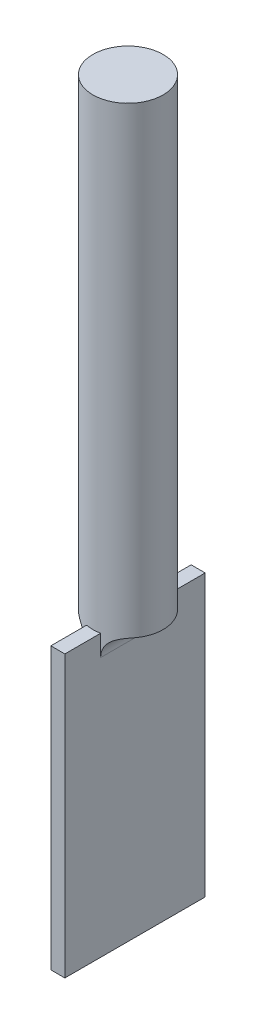
ISO-10303-21;
HEADER;
FILE_DESCRIPTION(('STEP AP214'),'2;1');
FILE_NAME('part.step','',(''),(''),'','','');
FILE_SCHEMA(('AUTOMOTIVE_DESIGN { 1 0 10303 214 1 1 1 1 }'));
ENDSEC;
DATA;
#1=APPLICATION_CONTEXT('core data for automotive mechanical design processes');
#2=APPLICATION_PROTOCOL_DEFINITION('international standard','automotive_design',2000,#1);
#3=PRODUCT_CONTEXT('',#1,'mechanical');
#4=PRODUCT('Part','Part','',(#3));
#5=PRODUCT_RELATED_PRODUCT_CATEGORY('part','',(#4));
#6=PRODUCT_DEFINITION_FORMATION('','',#4);
#7=PRODUCT_DEFINITION_CONTEXT('part definition',#1,'design');
#8=PRODUCT_DEFINITION('design','',#6,#7);
#9=PRODUCT_DEFINITION_SHAPE('','',#8);
#10=(LENGTH_UNIT() NAMED_UNIT(*) SI_UNIT(.MILLI.,.METRE.));
#11=(NAMED_UNIT(*) PLANE_ANGLE_UNIT() SI_UNIT($,.RADIAN.));
#12=(NAMED_UNIT(*) SI_UNIT($,.STERADIAN.) SOLID_ANGLE_UNIT());
#13=UNCERTAINTY_MEASURE_WITH_UNIT(LENGTH_MEASURE(1.E-05),#10,'distance_accuracy_value','');
#14=(GEOMETRIC_REPRESENTATION_CONTEXT(3) GLOBAL_UNCERTAINTY_ASSIGNED_CONTEXT((#13)) GLOBAL_UNIT_ASSIGNED_CONTEXT((#10,
#11,#12)) REPRESENTATION_CONTEXT('',''));
#15=CARTESIAN_POINT('',(0.,0.,0.));
#16=DIRECTION('',(0.,0.,1.));
#17=DIRECTION('',(1.,0.,0.));
#18=AXIS2_PLACEMENT_3D('',#15,#16,#17);
#19=CARTESIAN_POINT('',(0.,0.,0.));
#20=DIRECTION('',(0.,1.,0.));
#21=DIRECTION('',(0.,0.,1.));
#22=AXIS2_PLACEMENT_3D('',#19,#20,#21);
#23=PLANE('',#22);
#24=CARTESIAN_POINT('',(0.,0.,0.));
#25=DIRECTION('',(0.,1.,0.));
#26=DIRECTION('',(0.,0.,1.));
#27=AXIS2_PLACEMENT_3D('',#24,#25,#26);
#28=CIRCLE('',#27,6.35);
#29=CARTESIAN_POINT('',(5.08,0.,3.81));
#30=VERTEX_POINT('',#29);
#31=CARTESIAN_POINT('',(5.08,0.,-3.81));
#32=VERTEX_POINT('',#31);
#33=EDGE_CURVE('E175',#30,#32,#28,.T.);
#34=ORIENTED_EDGE('',*,*,#33,.F.);
#35=DIRECTION('',(0.,0.,1.));
#36=VECTOR('',#35,1.);
#37=CARTESIAN_POINT('',(5.08,0.,-6.22170394666927));
#38=LINE('',#37,#36);
#39=EDGE_CURVE('E185',#30,#32,#38,.F.);
#40=ORIENTED_EDGE('',*,*,#39,.T.);
#41=EDGE_LOOP('',(#34,#40));
#42=FACE_BOUND('',#41,.T.);
#43=ADVANCED_FACE('F39',(#42),#23,.F.);
#44=CARTESIAN_POINT('',(0.,83.82,0.));
#45=DIRECTION('',(0.,-1.,0.));
#46=DIRECTION('',(0.,0.,-1.));
#47=AXIS2_PLACEMENT_3D('',#44,#45,#46);
#48=CYLINDRICAL_SURFACE('',#47,6.35);
#49=CARTESIAN_POINT('',(0.,83.82,0.));
#50=DIRECTION('',(0.,1.,0.));
#51=DIRECTION('',(0.,0.,1.));
#52=AXIS2_PLACEMENT_3D('',#49,#50,#51);
#53=CIRCLE('',#52,6.35);
#54=CARTESIAN_POINT('',(0.,83.82,6.35));
#55=VERTEX_POINT('',#54);
#56=EDGE_CURVE('E166',#55,#55,#53,.T.);
#57=ORIENTED_EDGE('',*,*,#56,.F.);
#58=EDGE_LOOP('',(#57));
#59=FACE_BOUND('',#58,.T.);
#60=CARTESIAN_POINT('',(-1.27,0.,6.22170394666927));
#61=VERTEX_POINT('',#60);
#62=CARTESIAN_POINT('',(1.27,0.,6.22170394666927));
#63=VERTEX_POINT('',#62);
#64=EDGE_CURVE('E164',#61,#63,#28,.T.);
#65=ORIENTED_EDGE('',*,*,#64,.T.);
#66=DIRECTION('',(0.,-1.,0.));
#67=VECTOR('',#66,1.);
#68=CARTESIAN_POINT('',(1.27,-3.81,6.22170394666927));
#69=LINE('',#68,#67);
#70=CARTESIAN_POINT('',(1.27,-3.81,6.22170394666927));
#71=VERTEX_POINT('',#70);
#72=EDGE_CURVE('E177',#71,#63,#69,.F.);
#73=ORIENTED_EDGE('',*,*,#72,.F.);
#74=CARTESIAN_POINT('',(1.27,-3.81,6.22170394666927));
#75=CARTESIAN_POINT('',(1.26998793739721,-3.70623489363102,6.22168722016533));
#76=CARTESIAN_POINT('',(1.27423856433574,-3.60246989515915,6.22083812899461));
#77=CARTESIAN_POINT('',(1.29117947998453,-3.39565799828461,6.21735427499859));
#78=CARTESIAN_POINT('',(1.30387003834647,-3.29261112293191,6.21471945512006));
#79=CARTESIAN_POINT('',(1.33761589327543,-3.08789453820698,6.20754088873951));
#80=CARTESIAN_POINT('',(1.35867654240189,-2.98622575321079,6.20299592061648));
#81=CARTESIAN_POINT('',(1.40898646000373,-2.78505747179605,6.19176270983529));
#82=CARTESIAN_POINT('',(1.43823550073007,-2.6855579151263,6.18507452678701));
#83=CARTESIAN_POINT('',(1.50470440430106,-2.48935648428264,6.16924069958405));
#84=CARTESIAN_POINT('',(1.54193140664533,-2.39265720465215,6.16009285238957));
#85=CARTESIAN_POINT('',(1.62401841280142,-2.20283257505404,6.1389624666943));
#86=CARTESIAN_POINT('',(1.66888106548011,-2.10970847913205,6.12697894391045));
#87=CARTESIAN_POINT('',(1.76575155287849,-1.92785748912787,6.09976628046913));
#88=CARTESIAN_POINT('',(1.81775282880644,-1.83912665928657,6.08454011207531));
#89=CARTESIAN_POINT('',(1.92838753618004,-1.66665353831181,6.05038602574886));
#90=CARTESIAN_POINT('',(1.98702065442201,-1.58291101187941,6.0314582826007));
#91=CARTESIAN_POINT('',(2.10897668198812,-1.42273354326526,5.98988971756225));
#92=CARTESIAN_POINT('',(2.17217660634656,-1.34618279601193,5.96733436097372));
#93=CARTESIAN_POINT('',(2.30354760098341,-1.19903556189731,5.91786201203155));
#94=CARTESIAN_POINT('',(2.37171677424886,-1.12843682482023,5.89094667935447));
#95=CARTESIAN_POINT('',(2.51221213689452,-0.993611386983519,5.83241625074848));
#96=CARTESIAN_POINT('',(2.58453831179693,-0.929384664033891,5.80080117118701));
#97=CARTESIAN_POINT('',(2.7324275200643,-0.807638194553849,5.73262305338034));
#98=CARTESIAN_POINT('',(2.80799047189969,-0.750118279224692,5.69606013971362));
#99=CARTESIAN_POINT('',(2.95867747749816,-0.643884268646479,5.6192193514018));
#100=CARTESIAN_POINT('',(3.03372335073862,-0.594931473899038,5.57911755172669));
#101=CARTESIAN_POINT('',(3.18506035338194,-0.503472547293093,5.49412629289094));
#102=CARTESIAN_POINT('',(3.26135189301212,-0.460968588632297,5.44923522843406));
#103=CARTESIAN_POINT('',(3.41426706474028,-0.382344259635912,5.35475068103706));
#104=CARTESIAN_POINT('',(3.49089059260473,-0.346222016131616,5.30515858453845));
#105=CARTESIAN_POINT('',(3.64371003088014,-0.280112377361956,5.20138575443568));
#106=CARTESIAN_POINT('',(3.71990577320393,-0.250127249032978,5.14720333566321));
#107=CARTESIAN_POINT('',(3.8745661936935,-0.194743537139934,5.03189354835407));
#108=CARTESIAN_POINT('',(3.95297595868015,-0.169616353320168,4.97056218130154));
#109=CARTESIAN_POINT('',(4.10780162997255,-0.125244380112244,4.84340056000262));
#110=CARTESIAN_POINT('',(4.18421669862518,-0.106002026776457,4.77756845641562));
#111=CARTESIAN_POINT('',(4.40955571137198,-0.0563024193478578,4.57375173705416));
#112=CARTESIAN_POINT('',(4.55462750450787,-0.0338542669552364,4.42940667582586));
#113=CARTESIAN_POINT('',(4.76085662641197,-0.0127672896712092,4.20322332624395));
#114=CARTESIAN_POINT('',(4.82738641147119,-0.00782946019764055,4.12664057853695));
#115=CARTESIAN_POINT('',(4.95657665006043,-0.00145464874648546,3.9705235581936));
#116=CARTESIAN_POINT('',(5.01924817305936,-7.14838737102712E-06,3.89099888863545));
#117=CARTESIAN_POINT('',(5.08,0.,3.81));
#118=B_SPLINE_CURVE_WITH_KNOTS('',3,(#74,#75,#76,#77,#78,#79,#80,#81,#82,#83,#84,#85,#86,#87,
#88,#89,#90,#91,#92,#93,#94,#95,#96,#97,#98,#99,#100,#101,#102,#103,#104,#105,#106,#107,#108,
#109,#110,#111,#112,#113,#114,#115,#116,#117),.UNSPECIFIED.,.F.,.F.,(4,2,2,2,2,2,2,2,2,2,2,2,2,
2,2,2,2,2,2,2,2,4),(0.,0.311204945219113,0.622419833761724,0.933834061061613,1.24523962765599,
1.55692504440861,1.86871880848334,2.18022799784798,2.49172248162771,2.79673480959687,
3.10163130267924,3.4065267339481,3.71141448986936,4.00556993349037,4.29982428563136,
4.59399212386403,4.88826842690598,5.19595984737325,5.50377846623779,6.11920846278091,
6.42377345060547,6.72741945441038),.UNSPECIFIED.);
#119=EDGE_CURVE('E195',#71,#30,#118,.T.);
#120=ORIENTED_EDGE('',*,*,#119,.T.);
#121=ORIENTED_EDGE('',*,*,#33,.T.);
#122=CARTESIAN_POINT('',(5.08,0.,-3.81));
#123=CARTESIAN_POINT('',(5.00330797906707,-4.47873406911216E-06,-3.91228946664601));
#124=CARTESIAN_POINT('',(4.92346331248459,-0.00231679758030636,-4.01228163336102));
#125=CARTESIAN_POINT('',(4.75793482894148,-0.0127282182563427,-4.20723963387538));
#126=CARTESIAN_POINT('',(4.67224245716403,-0.0208359700203619,-4.30219772626395));
#127=CARTESIAN_POINT('',(4.49521454172408,-0.0440823902008019,-4.48687121482468));
#128=CARTESIAN_POINT('',(4.40384961621776,-0.0592608712863168,-4.57655364256303));
#129=CARTESIAN_POINT('',(4.21685881061943,-0.0978320894805859,-4.74939865433823));
#130=CARTESIAN_POINT('',(4.12123568824283,-0.121219575884682,-4.83256536451102));
#131=CARTESIAN_POINT('',(3.94476510968484,-0.172122651958333,-4.97713198851616));
#132=CARTESIAN_POINT('',(3.86444045406092,-0.198084303454596,-5.03971952095618));
#133=CARTESIAN_POINT('',(3.70248923781297,-0.25669508722016,-5.1598674824888));
#134=CARTESIAN_POINT('',(3.620862937612,-0.289342896877344,-5.21742890260692));
#135=CARTESIAN_POINT('',(3.45744507423277,-0.36161308187583,-5.32712209645205));
#136=CARTESIAN_POINT('',(3.37565474713196,-0.401214177883974,-5.37926968488347));
#137=CARTESIAN_POINT('',(3.21266166436294,-0.487702971321225,-5.47817416080688));
#138=CARTESIAN_POINT('',(3.13145889899345,-0.53459054815393,-5.52493113749499));
#139=CARTESIAN_POINT('',(2.97029800498385,-0.635985974727925,-5.61322682994161));
#140=CARTESIAN_POINT('',(2.89034815452815,-0.690530840287821,-5.65473821657145));
#141=CARTESIAN_POINT('',(2.73320718516041,-0.806963966239367,-5.73234329461289));
#142=CARTESIAN_POINT('',(2.65601612685089,-0.86885238781842,-5.76843686706676));
#143=CARTESIAN_POINT('',(2.50539056702062,-0.999759521622034,-5.83543666510538));
#144=CARTESIAN_POINT('',(2.43195952624069,-1.06878463217258,-5.86633816949768));
#145=CARTESIAN_POINT('',(2.28992097947075,-1.21349522099024,-5.92322689843369));
#146=CARTESIAN_POINT('',(2.22131326466018,-1.28918041059677,-5.9492143358089));
#147=CARTESIAN_POINT('',(2.09423994717148,-1.44135241309943,-5.99507393585589));
#148=CARTESIAN_POINT('',(2.03540239307904,-1.51744086476071,-6.01524033483812));
#149=CARTESIAN_POINT('',(1.92328221304443,-1.67445712788413,-6.05202183152592));
#150=CARTESIAN_POINT('',(1.87000155454147,-1.75538663749017,-6.06863567360751));
#151=CARTESIAN_POINT('',(1.76954722295613,-1.9215034405814,-6.09868468454762));
#152=CARTESIAN_POINT('',(1.72237285249152,-2.00669024630959,-6.11212021653743));
#153=CARTESIAN_POINT('',(1.63454318642517,-2.18075259771802,-6.13619047118929));
#154=CARTESIAN_POINT('',(1.59389016954312,-2.26962941918325,-6.14682421566886));
#155=CARTESIAN_POINT('',(1.48041852762844,-2.54540592568017,-6.17552666369294));
#156=CARTESIAN_POINT('',(1.41857310225978,-2.73736424107685,-6.18969877165444));
#157=CARTESIAN_POINT('',(1.32601912729589,-3.12874645807449,-6.21018886514179));
#158=CARTESIAN_POINT('',(1.29526124862716,-3.32815800990007,-6.21651929728878));
#159=CARTESIAN_POINT('',(1.27693781083457,-3.57539740664455,-6.22028317231951));
#160=CARTESIAN_POINT('',(1.27433477595701,-3.6223140025158,-6.22081719384414));
#161=CARTESIAN_POINT('',(1.27086798569016,-3.71614907084978,-6.22152755664664));
#162=CARTESIAN_POINT('',(1.27000182605007,-3.76306745069082,-6.22170439235758));
#163=CARTESIAN_POINT('',(1.27,-3.81,-6.22170394666927));
#164=B_SPLINE_CURVE_WITH_KNOTS('',3,(#122,#123,#124,#125,#126,#127,#128,#129,#130,#131,#132,
#133,#134,#135,#136,#137,#138,#139,#140,#141,#142,#143,#144,#145,#146,#147,#148,#149,#150,#151,
#152,#153,#154,#155,#156,#157,#158,#159,#160,#161,#162,#163),.UNSPECIFIED.,.F.,.F.,(4,2,2,2,2,2,
2,2,2,2,2,2,2,2,2,2,2,2,2,2,4),(0.,0.383542226160819,0.767658104208947,1.15396343528999,
1.54002212382674,1.85496842152536,2.16985247867761,2.48378916961725,2.79772066523627,
3.11322562210473,3.42873750543163,3.74453475173629,4.06031831751828,4.35480337773452,
4.64939235002186,4.94394764837806,5.23860564837817,5.8422506041638,6.44493619773998,
6.58589241636388,6.72665338280037),.UNSPECIFIED.);
#165=CARTESIAN_POINT('',(1.27,-3.81,-6.22170394666927));
#166=VERTEX_POINT('',#165);
#167=EDGE_CURVE('E200',#32,#166,#164,.T.);
#168=ORIENTED_EDGE('',*,*,#167,.T.);
#169=DIRECTION('',(0.,-1.,0.));
#170=VECTOR('',#169,1.);
#171=CARTESIAN_POINT('',(1.27,0.,-6.22170394666927));
#172=LINE('',#171,#170);
#173=CARTESIAN_POINT('',(1.27,0.,-6.22170394666927));
#174=VERTEX_POINT('',#173);
#175=EDGE_CURVE('E66',#174,#166,#172,.T.);
#176=ORIENTED_EDGE('',*,*,#175,.F.);
#177=CARTESIAN_POINT('',(-1.27,0.,-6.22170394666927));
#178=VERTEX_POINT('',#177);
#179=EDGE_CURVE('E179',#174,#178,#28,.T.);
#180=ORIENTED_EDGE('',*,*,#179,.T.);
#181=DIRECTION('',(0.,-1.,0.));
#182=VECTOR('',#181,1.);
#183=CARTESIAN_POINT('',(-1.27,-3.81,-6.22170394666927));
#184=LINE('',#183,#182);
#185=CARTESIAN_POINT('',(-1.27,-3.81,-6.22170394666927));
#186=VERTEX_POINT('',#185);
#187=EDGE_CURVE('E190',#186,#178,#184,.F.);
#188=ORIENTED_EDGE('',*,*,#187,.F.);
#189=CARTESIAN_POINT('',(-1.27,-3.81,-6.22170394666927));
#190=CARTESIAN_POINT('',(-1.26998793739721,-3.70623489363102,-6.22168722016533));
#191=CARTESIAN_POINT('',(-1.27423856433574,-3.60246989515915,-6.22083812899461));
#192=CARTESIAN_POINT('',(-1.29117947998453,-3.39565799828461,-6.21735427499859));
#193=CARTESIAN_POINT('',(-1.30387003834647,-3.29261112293191,-6.21471945512006));
#194=CARTESIAN_POINT('',(-1.33761589327543,-3.08789453820698,-6.20754088873951));
#195=CARTESIAN_POINT('',(-1.35867654240189,-2.98622575321079,-6.20299592061648));
#196=CARTESIAN_POINT('',(-1.40898646000373,-2.78505747179605,-6.19176270983529));
#197=CARTESIAN_POINT('',(-1.43823550073007,-2.6855579151263,-6.18507452678701));
#198=CARTESIAN_POINT('',(-1.50470440430106,-2.48935648428264,-6.16924069958405));
#199=CARTESIAN_POINT('',(-1.54193140664533,-2.39265720465215,-6.16009285238957));
#200=CARTESIAN_POINT('',(-1.62401841280142,-2.20283257505404,-6.1389624666943));
#201=CARTESIAN_POINT('',(-1.66888106548011,-2.10970847913205,-6.12697894391045));
#202=CARTESIAN_POINT('',(-1.76575155287849,-1.92785748912787,-6.09976628046913));
#203=CARTESIAN_POINT('',(-1.81775282880644,-1.83912665928657,-6.08454011207531));
#204=CARTESIAN_POINT('',(-1.92838753618004,-1.66665353831181,-6.05038602574886));
#205=CARTESIAN_POINT('',(-1.98702065442201,-1.58291101187941,-6.0314582826007));
#206=CARTESIAN_POINT('',(-2.10897668198812,-1.42273354326526,-5.98988971756225));
#207=CARTESIAN_POINT('',(-2.17217660634656,-1.34618279601193,-5.96733436097372));
#208=CARTESIAN_POINT('',(-2.30354760098341,-1.19903556189731,-5.91786201203155));
#209=CARTESIAN_POINT('',(-2.37171677424886,-1.12843682482023,-5.89094667935447));
#210=CARTESIAN_POINT('',(-2.51221213689452,-0.993611386983519,-5.83241625074848));
#211=CARTESIAN_POINT('',(-2.58453831179693,-0.929384664033891,-5.80080117118701));
#212=CARTESIAN_POINT('',(-2.7324275200643,-0.807638194553849,-5.73262305338034));
#213=CARTESIAN_POINT('',(-2.80799047189969,-0.750118279224692,-5.69606013971362));
#214=CARTESIAN_POINT('',(-2.95867747749816,-0.643884268646479,-5.6192193514018));
#215=CARTESIAN_POINT('',(-3.03372335073862,-0.594931473899038,-5.57911755172669));
#216=CARTESIAN_POINT('',(-3.18506035338194,-0.503472547293093,-5.49412629289094));
#217=CARTESIAN_POINT('',(-3.26135189301212,-0.460968588632297,-5.44923522843406));
#218=CARTESIAN_POINT('',(-3.41426706474028,-0.382344259635912,-5.35475068103706));
#219=CARTESIAN_POINT('',(-3.49089059260473,-0.346222016131616,-5.30515858453845));
#220=CARTESIAN_POINT('',(-3.64371003088014,-0.280112377361956,-5.20138575443568));
#221=CARTESIAN_POINT('',(-3.71990577320393,-0.250127249032978,-5.14720333566321));
#222=CARTESIAN_POINT('',(-3.8745661936935,-0.194743537139934,-5.03189354835407));
#223=CARTESIAN_POINT('',(-3.95297595868015,-0.169616353320168,-4.97056218130154));
#224=CARTESIAN_POINT('',(-4.10780162997255,-0.125244380112244,-4.84340056000262));
#225=CARTESIAN_POINT('',(-4.18421669862518,-0.106002026776457,-4.77756845641562));
#226=CARTESIAN_POINT('',(-4.40955571137198,-0.0563024193478578,-4.57375173705416));
#227=CARTESIAN_POINT('',(-4.55462750450787,-0.0338542669552364,-4.42940667582586));
#228=CARTESIAN_POINT('',(-4.76085662641197,-0.0127672896712092,-4.20322332624395));
#229=CARTESIAN_POINT('',(-4.82738641147119,-0.00782946019764055,-4.12664057853695));
#230=CARTESIAN_POINT('',(-4.95657665006043,-0.00145464874648546,-3.9705235581936));
#231=CARTESIAN_POINT('',(-5.01924817305936,-7.14838737102712E-06,-3.89099888863545));
#232=CARTESIAN_POINT('',(-5.08,0.,-3.81));
#233=B_SPLINE_CURVE_WITH_KNOTS('',3,(#189,#190,#191,#192,#193,#194,#195,#196,#197,#198,#199,
#200,#201,#202,#203,#204,#205,#206,#207,#208,#209,#210,#211,#212,#213,#214,#215,#216,#217,#218,
#219,#220,#221,#222,#223,#224,#225,#226,#227,#228,#229,#230,#231,#232),.UNSPECIFIED.,.F.,.F.,(4,
2,2,2,2,2,2,2,2,2,2,2,2,2,2,2,2,2,2,2,2,4),(0.,0.311204945219113,0.622419833761724,
0.933834061061613,1.24523962765599,1.55692504440861,1.86871880848334,2.18022799784798,
2.49172248162771,2.79673480959687,3.10163130267924,3.4065267339481,3.71141448986936,
4.00556993349037,4.29982428563136,4.59399212386403,4.88826842690598,5.19595984737325,
5.50377846623779,6.11920846278091,6.42377345060547,6.72741945441038),.UNSPECIFIED.);
#234=CARTESIAN_POINT('',(-5.08,0.,-3.81));
#235=VERTEX_POINT('',#234);
#236=EDGE_CURVE('E11',#186,#235,#233,.T.);
#237=ORIENTED_EDGE('',*,*,#236,.T.);
#238=CARTESIAN_POINT('',(-5.08,0.,3.81));
#239=VERTEX_POINT('',#238);
#240=EDGE_CURVE('E173',#235,#239,#28,.T.);
#241=ORIENTED_EDGE('',*,*,#240,.T.);
#242=CARTESIAN_POINT('',(-5.08,0.,3.81));
#243=CARTESIAN_POINT('',(-5.00330797906707,-4.47873406911216E-06,3.91228946664601));
#244=CARTESIAN_POINT('',(-4.92346331248459,-0.00231679758030636,4.01228163336102));
#245=CARTESIAN_POINT('',(-4.75793482894148,-0.0127282182563427,4.20723963387538));
#246=CARTESIAN_POINT('',(-4.67224245716403,-0.0208359700203619,4.30219772626395));
#247=CARTESIAN_POINT('',(-4.49521454172408,-0.0440823902008019,4.48687121482468));
#248=CARTESIAN_POINT('',(-4.40384961621776,-0.0592608712863168,4.57655364256303));
#249=CARTESIAN_POINT('',(-4.21685881061943,-0.0978320894805859,4.74939865433823));
#250=CARTESIAN_POINT('',(-4.12123568824283,-0.121219575884682,4.83256536451102));
#251=CARTESIAN_POINT('',(-3.94476510968484,-0.172122651958333,4.97713198851616));
#252=CARTESIAN_POINT('',(-3.86444045406092,-0.198084303454596,5.03971952095618));
#253=CARTESIAN_POINT('',(-3.70248923781297,-0.25669508722016,5.1598674824888));
#254=CARTESIAN_POINT('',(-3.620862937612,-0.289342896877344,5.21742890260692));
#255=CARTESIAN_POINT('',(-3.45744507423277,-0.36161308187583,5.32712209645205));
#256=CARTESIAN_POINT('',(-3.37565474713196,-0.401214177883974,5.37926968488347));
#257=CARTESIAN_POINT('',(-3.21266166436294,-0.487702971321225,5.47817416080688));
#258=CARTESIAN_POINT('',(-3.13145889899345,-0.53459054815393,5.52493113749499));
#259=CARTESIAN_POINT('',(-2.97029800498385,-0.635985974727925,5.61322682994161));
#260=CARTESIAN_POINT('',(-2.89034815452815,-0.690530840287821,5.65473821657145));
#261=CARTESIAN_POINT('',(-2.73320718516041,-0.806963966239367,5.73234329461289));
#262=CARTESIAN_POINT('',(-2.65601612685089,-0.86885238781842,5.76843686706676));
#263=CARTESIAN_POINT('',(-2.50539056702062,-0.999759521622034,5.83543666510538));
#264=CARTESIAN_POINT('',(-2.43195952624069,-1.06878463217258,5.86633816949768));
#265=CARTESIAN_POINT('',(-2.28992097947075,-1.21349522099024,5.92322689843369));
#266=CARTESIAN_POINT('',(-2.22131326466018,-1.28918041059677,5.9492143358089));
#267=CARTESIAN_POINT('',(-2.09423994717148,-1.44135241309943,5.99507393585589));
#268=CARTESIAN_POINT('',(-2.03540239307904,-1.51744086476071,6.01524033483812));
#269=CARTESIAN_POINT('',(-1.92328221304443,-1.67445712788413,6.05202183152592));
#270=CARTESIAN_POINT('',(-1.87000155454147,-1.75538663749017,6.06863567360751));
#271=CARTESIAN_POINT('',(-1.76954722295613,-1.9215034405814,6.09868468454762));
#272=CARTESIAN_POINT('',(-1.72237285249152,-2.00669024630959,6.11212021653743));
#273=CARTESIAN_POINT('',(-1.63454318642517,-2.18075259771802,6.13619047118929));
#274=CARTESIAN_POINT('',(-1.59389016954312,-2.26962941918325,6.14682421566886));
#275=CARTESIAN_POINT('',(-1.48041852762844,-2.54540592568017,6.17552666369294));
#276=CARTESIAN_POINT('',(-1.41857310225978,-2.73736424107685,6.18969877165444));
#277=CARTESIAN_POINT('',(-1.32601912729589,-3.12874645807449,6.21018886514179));
#278=CARTESIAN_POINT('',(-1.29526124862716,-3.32815800990007,6.21651929728878));
#279=CARTESIAN_POINT('',(-1.27693781083457,-3.57539740664455,6.22028317231951));
#280=CARTESIAN_POINT('',(-1.27433477595701,-3.6223140025158,6.22081719384414));
#281=CARTESIAN_POINT('',(-1.27086798569016,-3.71614907084978,6.22152755664664));
#282=CARTESIAN_POINT('',(-1.27000182605007,-3.76306745069082,6.22170439235758));
#283=CARTESIAN_POINT('',(-1.27,-3.81,6.22170394666927));
#284=B_SPLINE_CURVE_WITH_KNOTS('',3,(#242,#243,#244,#245,#246,#247,#248,#249,#250,#251,#252,
#253,#254,#255,#256,#257,#258,#259,#260,#261,#262,#263,#264,#265,#266,#267,#268,#269,#270,#271,
#272,#273,#274,#275,#276,#277,#278,#279,#280,#281,#282,#283),.UNSPECIFIED.,.F.,.F.,(4,2,2,2,2,2,
2,2,2,2,2,2,2,2,2,2,2,2,2,2,4),(0.,0.383542226160819,0.767658104208947,1.15396343528999,
1.54002212382674,1.85496842152536,2.16985247867761,2.48378916961725,2.79772066523627,
3.11322562210473,3.42873750543163,3.74453475173629,4.06031831751828,4.35480337773452,
4.64939235002186,4.94394764837806,5.23860564837817,5.8422506041638,6.44493619773998,
6.58589241636388,6.72665338280037),.UNSPECIFIED.);
#285=CARTESIAN_POINT('',(-1.27,-3.81,6.22170394666927));
#286=VERTEX_POINT('',#285);
#287=EDGE_CURVE('E52',#239,#286,#284,.T.);
#288=ORIENTED_EDGE('',*,*,#287,.T.);
#289=DIRECTION('',(0.,-1.,0.));
#290=VECTOR('',#289,1.);
#291=CARTESIAN_POINT('',(-1.27,0.,6.22170394666927));
#292=LINE('',#291,#290);
#293=EDGE_CURVE('E58',#61,#286,#292,.T.);
#294=ORIENTED_EDGE('',*,*,#293,.F.);
#295=EDGE_LOOP('',(#65,#73,#120,#121,#168,#176,#180,#188,#237,#241,#288,#294));
#296=FACE_BOUND('',#295,.T.);
#297=ADVANCED_FACE('F204',(#59,#296),#48,.T.);
#298=CARTESIAN_POINT('',(0.,83.82,0.));
#299=DIRECTION('',(0.,1.,0.));
#300=DIRECTION('',(0.,0.,1.));
#301=AXIS2_PLACEMENT_3D('',#298,#299,#300);
#302=PLANE('',#301);
#303=ORIENTED_EDGE('',*,*,#56,.T.);
#304=EDGE_LOOP('',(#303));
#305=FACE_BOUND('',#304,.T.);
#306=ADVANCED_FACE('F230',(#305),#302,.T.);
#307=ORIENTED_EDGE('',*,*,#240,.F.);
#308=DIRECTION('',(0.,0.,1.));
#309=VECTOR('',#308,1.);
#310=CARTESIAN_POINT('',(-5.08,0.,0.));
#311=LINE('',#310,#309);
#312=EDGE_CURVE('E184',#235,#239,#311,.T.);
#313=ORIENTED_EDGE('',*,*,#312,.T.);
#314=EDGE_LOOP('',(#307,#313));
#315=FACE_BOUND('',#314,.T.);
#316=ADVANCED_FACE('F225',(#315),#23,.F.);
#317=CARTESIAN_POINT('',(-1.27,0.,12.7));
#318=DIRECTION('',(0.,1.,0.));
#319=DIRECTION('',(0.,0.,1.));
#320=AXIS2_PLACEMENT_3D('',#317,#318,#319);
#321=PLANE('',#320);
#322=ORIENTED_EDGE('',*,*,#179,.F.);
#323=DIRECTION('',(0.,0.,1.));
#324=VECTOR('',#323,1.);
#325=CARTESIAN_POINT('',(1.27,0.,12.7));
#326=LINE('',#325,#324);
#327=CARTESIAN_POINT('',(1.27,0.,-12.7));
#328=VERTEX_POINT('',#327);
#329=EDGE_CURVE('E155',#328,#174,#326,.T.);
#330=ORIENTED_EDGE('',*,*,#329,.F.);
#331=DIRECTION('',(1.,0.,0.));
#332=VECTOR('',#331,1.);
#333=CARTESIAN_POINT('',(-1.27,0.,-12.7));
#334=LINE('',#333,#332);
#335=CARTESIAN_POINT('',(-1.27,0.,-12.7));
#336=VERTEX_POINT('',#335);
#337=EDGE_CURVE('E167',#336,#328,#334,.T.);
#338=ORIENTED_EDGE('',*,*,#337,.F.);
#339=DIRECTION('',(0.,0.,1.));
#340=VECTOR('',#339,1.);
#341=CARTESIAN_POINT('',(-1.27,0.,12.7));
#342=LINE('',#341,#340);
#343=EDGE_CURVE('E134',#336,#178,#342,.T.);
#344=ORIENTED_EDGE('',*,*,#343,.T.);
#345=EDGE_LOOP('',(#322,#330,#338,#344));
#346=FACE_BOUND('',#345,.T.);
#347=ADVANCED_FACE('F231',(#346),#321,.T.);
#348=ORIENTED_EDGE('',*,*,#64,.F.);
#349=CARTESIAN_POINT('',(-1.27,0.,12.7));
#350=VERTEX_POINT('',#349);
#351=EDGE_CURVE('E159',#61,#350,#342,.T.);
#352=ORIENTED_EDGE('',*,*,#351,.T.);
#353=DIRECTION('',(1.,0.,0.));
#354=VECTOR('',#353,1.);
#355=CARTESIAN_POINT('',(-1.27,0.,12.7));
#356=LINE('',#355,#354);
#357=CARTESIAN_POINT('',(1.27,0.,12.7));
#358=VERTEX_POINT('',#357);
#359=EDGE_CURVE('E162',#350,#358,#356,.T.);
#360=ORIENTED_EDGE('',*,*,#359,.T.);
#361=EDGE_CURVE('E150',#63,#358,#326,.T.);
#362=ORIENTED_EDGE('',*,*,#361,.F.);
#363=EDGE_LOOP('',(#348,#352,#360,#362));
#364=FACE_BOUND('',#363,.T.);
#365=ADVANCED_FACE('F236',(#364),#321,.T.);
#366=CARTESIAN_POINT('',(-1.27,-50.8,12.7));
#367=DIRECTION('',(0.,0.,1.));
#368=DIRECTION('',(1.,0.,0.));
#369=AXIS2_PLACEMENT_3D('',#366,#367,#368);
#370=PLANE('',#369);
#371=DIRECTION('',(1.,0.,0.));
#372=VECTOR('',#371,1.);
#373=CARTESIAN_POINT('',(-1.27,-50.8,12.7));
#374=LINE('',#373,#372);
#375=CARTESIAN_POINT('',(-1.27,-50.8,12.7));
#376=VERTEX_POINT('',#375);
#377=CARTESIAN_POINT('',(1.27,-50.8,12.7));
#378=VERTEX_POINT('',#377);
#379=EDGE_CURVE('E121',#376,#378,#374,.T.);
#380=ORIENTED_EDGE('',*,*,#379,.T.);
#381=DIRECTION('',(0.,-1.,0.));
#382=VECTOR('',#381,1.);
#383=CARTESIAN_POINT('',(1.27,-50.8,12.7));
#384=LINE('',#383,#382);
#385=EDGE_CURVE('E130',#358,#378,#384,.T.);
#386=ORIENTED_EDGE('',*,*,#385,.F.);
#387=ORIENTED_EDGE('',*,*,#359,.F.);
#388=DIRECTION('',(0.,-1.,0.));
#389=VECTOR('',#388,1.);
#390=CARTESIAN_POINT('',(-1.27,-50.8,12.7));
#391=LINE('',#390,#389);
#392=EDGE_CURVE('E129',#350,#376,#391,.T.);
#393=ORIENTED_EDGE('',*,*,#392,.T.);
#394=EDGE_LOOP('',(#380,#386,#387,#393));
#395=FACE_BOUND('',#394,.T.);
#396=ADVANCED_FACE('F123',(#395),#370,.T.);
#397=CARTESIAN_POINT('',(-1.27,-50.8,-12.7));
#398=DIRECTION('',(0.,0.,-1.));
#399=DIRECTION('',(0.,1.,0.));
#400=AXIS2_PLACEMENT_3D('',#397,#398,#399);
#401=PLANE('',#400);
#402=ORIENTED_EDGE('',*,*,#337,.T.);
#403=DIRECTION('',(0.,1.,0.));
#404=VECTOR('',#403,1.);
#405=CARTESIAN_POINT('',(1.27,-50.8,-12.7));
#406=LINE('',#405,#404);
#407=CARTESIAN_POINT('',(1.27,-50.8,-12.7));
#408=VERTEX_POINT('',#407);
#409=EDGE_CURVE('E142',#408,#328,#406,.T.);
#410=ORIENTED_EDGE('',*,*,#409,.F.);
#411=DIRECTION('',(1.,0.,0.));
#412=VECTOR('',#411,1.);
#413=CARTESIAN_POINT('',(-1.27,-50.8,-12.7));
#414=LINE('',#413,#412);
#415=CARTESIAN_POINT('',(-1.27,-50.8,-12.7));
#416=VERTEX_POINT('',#415);
#417=EDGE_CURVE('E133',#416,#408,#414,.T.);
#418=ORIENTED_EDGE('',*,*,#417,.F.);
#419=DIRECTION('',(0.,1.,0.));
#420=VECTOR('',#419,1.);
#421=CARTESIAN_POINT('',(-1.27,-50.8,-12.7));
#422=LINE('',#421,#420);
#423=EDGE_CURVE('E160',#416,#336,#422,.T.);
#424=ORIENTED_EDGE('',*,*,#423,.T.);
#425=EDGE_LOOP('',(#402,#410,#418,#424));
#426=FACE_BOUND('',#425,.T.);
#427=ADVANCED_FACE('F263',(#426),#401,.T.);
#428=CARTESIAN_POINT('',(-1.27,-50.8,12.7));
#429=DIRECTION('',(0.,-1.,0.));
#430=DIRECTION('',(0.,0.,-1.));
#431=AXIS2_PLACEMENT_3D('',#428,#429,#430);
#432=PLANE('',#431);
#433=ORIENTED_EDGE('',*,*,#417,.T.);
#434=DIRECTION('',(0.,0.,-1.));
#435=VECTOR('',#434,1.);
#436=CARTESIAN_POINT('',(1.27,-50.8,12.7));
#437=LINE('',#436,#435);
#438=EDGE_CURVE('E136',#378,#408,#437,.T.);
#439=ORIENTED_EDGE('',*,*,#438,.F.);
#440=ORIENTED_EDGE('',*,*,#379,.F.);
#441=DIRECTION('',(0.,0.,-1.));
#442=VECTOR('',#441,1.);
#443=CARTESIAN_POINT('',(-1.27,-50.8,12.7));
#444=LINE('',#443,#442);
#445=EDGE_CURVE('E154',#376,#416,#444,.T.);
#446=ORIENTED_EDGE('',*,*,#445,.T.);
#447=EDGE_LOOP('',(#433,#439,#440,#446));
#448=FACE_BOUND('',#447,.T.);
#449=ADVANCED_FACE('F140',(#448),#432,.T.);
#450=CARTESIAN_POINT('',(-1.27,0.,0.));
#451=DIRECTION('',(-1.,0.,0.));
#452=DIRECTION('',(0.,0.,1.));
#453=AXIS2_PLACEMENT_3D('',#450,#451,#452);
#454=PLANE('',#453);
#455=ORIENTED_EDGE('',*,*,#351,.F.);
#456=ORIENTED_EDGE('',*,*,#293,.T.);
#457=DIRECTION('',(0.,0.,1.));
#458=VECTOR('',#457,1.);
#459=CARTESIAN_POINT('',(-1.27,-3.81,0.));
#460=LINE('',#459,#458);
#461=EDGE_CURVE('E189',#286,#186,#460,.F.);
#462=ORIENTED_EDGE('',*,*,#461,.T.);
#463=ORIENTED_EDGE('',*,*,#187,.T.);
#464=ORIENTED_EDGE('',*,*,#343,.F.);
#465=ORIENTED_EDGE('',*,*,#423,.F.);
#466=ORIENTED_EDGE('',*,*,#445,.F.);
#467=ORIENTED_EDGE('',*,*,#392,.F.);
#468=EDGE_LOOP('',(#455,#456,#462,#463,#464,#465,#466,#467));
#469=FACE_BOUND('',#468,.T.);
#470=ADVANCED_FACE('F220',(#469),#454,.T.);
#471=CARTESIAN_POINT('',(1.27,0.,0.));
#472=DIRECTION('',(-1.,0.,0.));
#473=DIRECTION('',(0.,0.,1.));
#474=AXIS2_PLACEMENT_3D('',#471,#472,#473);
#475=PLANE('',#474);
#476=DIRECTION('',(0.,0.,1.));
#477=VECTOR('',#476,1.);
#478=CARTESIAN_POINT('',(1.27,-3.81,6.22170394666927));
#479=LINE('',#478,#477);
#480=EDGE_CURVE('E180',#166,#71,#479,.T.);
#481=ORIENTED_EDGE('',*,*,#480,.T.);
#482=ORIENTED_EDGE('',*,*,#72,.T.);
#483=ORIENTED_EDGE('',*,*,#361,.T.);
#484=ORIENTED_EDGE('',*,*,#385,.T.);
#485=ORIENTED_EDGE('',*,*,#438,.T.);
#486=ORIENTED_EDGE('',*,*,#409,.T.);
#487=ORIENTED_EDGE('',*,*,#329,.T.);
#488=ORIENTED_EDGE('',*,*,#175,.T.);
#489=EDGE_LOOP('',(#481,#482,#483,#484,#485,#486,#487,#488));
#490=FACE_BOUND('',#489,.T.);
#491=ADVANCED_FACE('F144',(#490),#475,.F.);
#492=CARTESIAN_POINT('',(5.08,-3.81,0.));
#493=DIRECTION('',(0.,0.,-1.));
#494=DIRECTION('',(-1.,0.,0.));
#495=AXIS2_PLACEMENT_3D('',#492,#493,#494);
#496=CYLINDRICAL_SURFACE('',#495,3.81);
#497=ORIENTED_EDGE('',*,*,#167,.F.);
#498=ORIENTED_EDGE('',*,*,#39,.F.);
#499=ORIENTED_EDGE('',*,*,#119,.F.);
#500=ORIENTED_EDGE('',*,*,#480,.F.);
#501=EDGE_LOOP('',(#497,#498,#499,#500));
#502=FACE_BOUND('',#501,.T.);
#503=ADVANCED_FACE('F210',(#502),#496,.F.);
#504=CARTESIAN_POINT('',(-5.08,-3.81,0.));
#505=DIRECTION('',(0.,0.,1.));
#506=DIRECTION('',(1.,0.,0.));
#507=AXIS2_PLACEMENT_3D('',#504,#505,#506);
#508=CYLINDRICAL_SURFACE('',#507,3.81);
#509=ORIENTED_EDGE('',*,*,#236,.F.);
#510=ORIENTED_EDGE('',*,*,#461,.F.);
#511=ORIENTED_EDGE('',*,*,#287,.F.);
#512=ORIENTED_EDGE('',*,*,#312,.F.);
#513=EDGE_LOOP('',(#509,#510,#511,#512));
#514=FACE_BOUND('',#513,.T.);
#515=ADVANCED_FACE('F41',(#514),#508,.F.);
#516=CLOSED_SHELL('',(#43,#297,#306,#316,#347,#365,#396,#427,#449,#470,#491,#503,#515));
#517=MANIFOLD_SOLID_BREP('B2',#516);
#518=ADVANCED_BREP_SHAPE_REPRESENTATION('',(#18,#517),#14);
#519=SHAPE_DEFINITION_REPRESENTATION(#9,#518);
ENDSEC;
END-ISO-10303-21;
